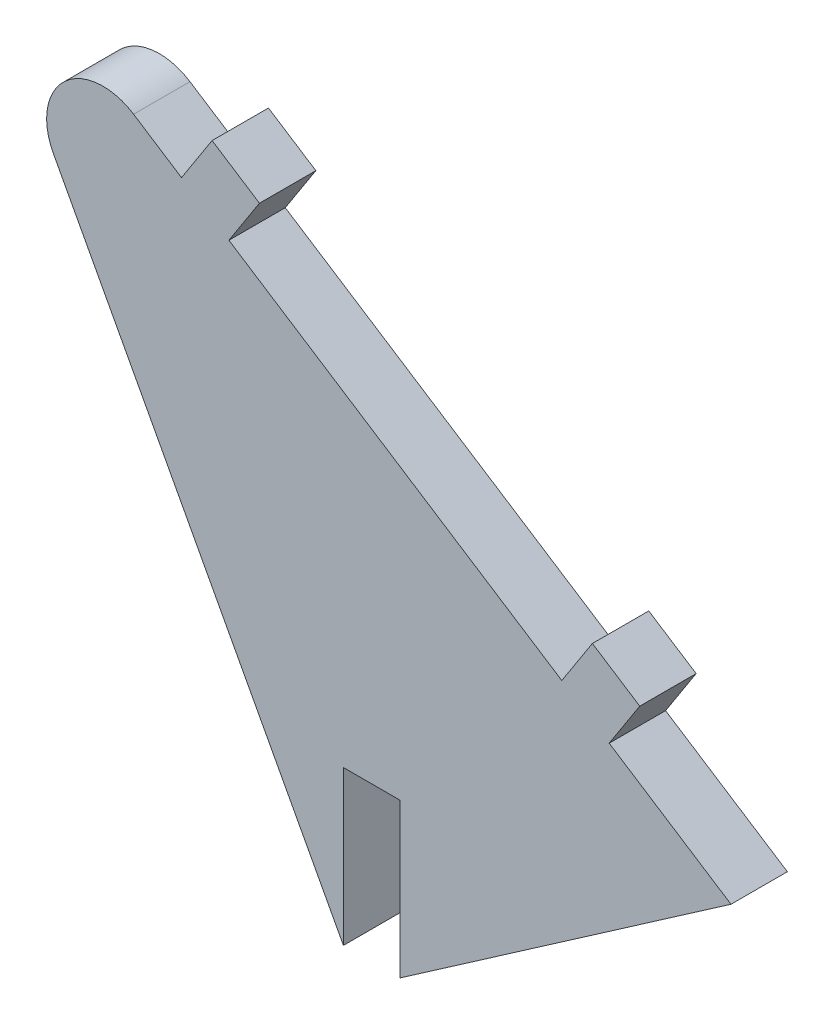
ISO-10303-21;
HEADER;
FILE_DESCRIPTION(('STEP AP214'),'2;1');
FILE_NAME('part.step','',(''),(''),'','','');
FILE_SCHEMA(('AUTOMOTIVE_DESIGN { 1 0 10303 214 1 1 1 1 }'));
ENDSEC;
DATA;
#1=APPLICATION_CONTEXT('core data for automotive mechanical design processes');
#2=APPLICATION_PROTOCOL_DEFINITION('international standard','automotive_design',2000,#1);
#3=PRODUCT_CONTEXT('',#1,'mechanical');
#4=PRODUCT('Part','Part','',(#3));
#5=PRODUCT_RELATED_PRODUCT_CATEGORY('part','',(#4));
#6=PRODUCT_DEFINITION_FORMATION('','',#4);
#7=PRODUCT_DEFINITION_CONTEXT('part definition',#1,'design');
#8=PRODUCT_DEFINITION('design','',#6,#7);
#9=PRODUCT_DEFINITION_SHAPE('','',#8);
#10=(LENGTH_UNIT() NAMED_UNIT(*) SI_UNIT(.MILLI.,.METRE.));
#11=(NAMED_UNIT(*) PLANE_ANGLE_UNIT() SI_UNIT($,.RADIAN.));
#12=(NAMED_UNIT(*) SI_UNIT($,.STERADIAN.) SOLID_ANGLE_UNIT());
#13=UNCERTAINTY_MEASURE_WITH_UNIT(LENGTH_MEASURE(1.E-05),#10,'distance_accuracy_value','');
#14=(GEOMETRIC_REPRESENTATION_CONTEXT(3) GLOBAL_UNCERTAINTY_ASSIGNED_CONTEXT((#13)) GLOBAL_UNIT_ASSIGNED_CONTEXT((#10,
#11,#12)) REPRESENTATION_CONTEXT('',''));
#15=CARTESIAN_POINT('',(0.,0.,0.));
#16=DIRECTION('',(0.,0.,1.));
#17=DIRECTION('',(1.,0.,0.));
#18=AXIS2_PLACEMENT_3D('',#15,#16,#17);
#19=CARTESIAN_POINT('',(-4.37541502486741,84.7624332406662,1.524));
#20=DIRECTION('',(0.840244242098891,-0.542208090699189,0.));
#21=DIRECTION('',(0.542208090699189,0.840244242098891,0.));
#22=AXIS2_PLACEMENT_3D('',#19,#20,#21);
#23=PLANE('',#22);
#24=DIRECTION('',(-0.542208090699189,-0.840244242098891,0.));
#25=VECTOR('',#24,1.);
#26=CARTESIAN_POINT('',(-4.37541502486741,84.7624332406662,0.));
#27=LINE('',#26,#25);
#28=CARTESIAN_POINT('',(-3.54908989464185,86.0429654656249,0.));
#29=VERTEX_POINT('',#28);
#30=CARTESIAN_POINT('',(-4.37541502486741,84.7624332406662,0.));
#31=VERTEX_POINT('',#30);
#32=EDGE_CURVE('E157',#29,#31,#27,.T.);
#33=ORIENTED_EDGE('',*,*,#32,.T.);
#34=DIRECTION('',(0.,0.,-1.));
#35=VECTOR('',#34,1.);
#36=CARTESIAN_POINT('',(-4.37541502486741,84.7624332406662,1.524));
#37=LINE('',#36,#35);
#38=CARTESIAN_POINT('',(-4.37541502486741,84.7624332406662,1.524));
#39=VERTEX_POINT('',#38);
#40=EDGE_CURVE('E140',#39,#31,#37,.T.);
#41=ORIENTED_EDGE('',*,*,#40,.F.);
#42=DIRECTION('',(-0.542208090699189,-0.840244242098891,0.));
#43=VECTOR('',#42,1.);
#44=CARTESIAN_POINT('',(-4.37541502486741,84.7624332406662,1.524));
#45=LINE('',#44,#43);
#46=CARTESIAN_POINT('',(-3.54908989464185,86.0429654656249,1.524));
#47=VERTEX_POINT('',#46);
#48=EDGE_CURVE('E145',#47,#39,#45,.T.);
#49=ORIENTED_EDGE('',*,*,#48,.F.);
#50=DIRECTION('',(0.,0.,-1.));
#51=VECTOR('',#50,1.);
#52=CARTESIAN_POINT('',(-3.54908989464185,86.0429654656249,1.524));
#53=LINE('',#52,#51);
#54=EDGE_CURVE('E197',#47,#29,#53,.T.);
#55=ORIENTED_EDGE('',*,*,#54,.T.);
#56=EDGE_LOOP('',(#33,#41,#49,#55));
#57=FACE_BOUND('',#56,.T.);
#58=ADVANCED_FACE('F33',(#57),#23,.F.);
#59=CARTESIAN_POINT('',(-10.628767587537,88.7977103465281,1.524));
#60=DIRECTION('',(-0.542208090699188,-0.840244242098892,0.));
#61=DIRECTION('',(0.840244242098892,-0.542208090699188,0.));
#62=AXIS2_PLACEMENT_3D('',#59,#60,#61);
#63=PLANE('',#62);
#64=DIRECTION('',(-0.840244242098892,0.542208090699188,0.));
#65=VECTOR('',#64,1.);
#66=CARTESIAN_POINT('',(-10.628767587537,88.7977103465281,0.));
#67=LINE('',#66,#65);
#68=CARTESIAN_POINT('',(-5.67048846499267,85.5981417907557,0.));
#69=VERTEX_POINT('',#68);
#70=EDGE_CURVE('E222',#31,#69,#67,.T.);
#71=ORIENTED_EDGE('',*,*,#70,.T.);
#72=DIRECTION('',(0.,0.,-1.));
#73=VECTOR('',#72,1.);
#74=CARTESIAN_POINT('',(-5.67048846499267,85.5981417907557,1.524));
#75=LINE('',#74,#73);
#76=CARTESIAN_POINT('',(-5.67048846499267,85.5981417907557,1.524));
#77=VERTEX_POINT('',#76);
#78=EDGE_CURVE('E41',#69,#77,#75,.F.);
#79=ORIENTED_EDGE('',*,*,#78,.T.);
#80=DIRECTION('',(-0.840244242098892,0.542208090699188,0.));
#81=VECTOR('',#80,1.);
#82=CARTESIAN_POINT('',(-10.628767587537,88.7977103465281,1.524));
#83=LINE('',#82,#81);
#84=EDGE_CURVE('E136',#39,#77,#83,.T.);
#85=ORIENTED_EDGE('',*,*,#84,.F.);
#86=ORIENTED_EDGE('',*,*,#40,.T.);
#87=EDGE_LOOP('',(#71,#79,#85,#86));
#88=FACE_BOUND('',#87,.T.);
#89=ADVANCED_FACE('F138',(#88),#63,.F.);
#90=CARTESIAN_POINT('',(0.,68.978612676176,1.524));
#91=DIRECTION('',(0.881268993731085,0.472615023764797,0.));
#92=DIRECTION('',(-0.472615023764797,0.881268993731085,0.));
#93=AXIS2_PLACEMENT_3D('',#90,#91,#92);
#94=PLANE('',#93);
#95=DIRECTION('',(0.472615023764797,-0.881268993731085,0.));
#96=VECTOR('',#95,1.);
#97=CARTESIAN_POINT('',(0.,68.978612676176,1.524));
#98=LINE('',#97,#96);
#99=CARTESIAN_POINT('',(-7.8398675416644,83.5973442695795,1.524));
#100=VERTEX_POINT('',#99);
#101=CARTESIAN_POINT('',(0.,68.978612676176,1.524));
#102=VERTEX_POINT('',#101);
#103=EDGE_CURVE('E144',#100,#102,#98,.T.);
#104=ORIENTED_EDGE('',*,*,#103,.F.);
#105=DIRECTION('',(0.,0.,-1.));
#106=VECTOR('',#105,1.);
#107=CARTESIAN_POINT('',(-7.8398675416644,83.5973442695795,1.524));
#108=LINE('',#107,#106);
#109=CARTESIAN_POINT('',(-7.8398675416644,83.5973442695795,0.));
#110=VERTEX_POINT('',#109);
#111=EDGE_CURVE('E158',#100,#110,#108,.T.);
#112=ORIENTED_EDGE('',*,*,#111,.T.);
#113=DIRECTION('',(0.472615023764797,-0.881268993731085,0.));
#114=VECTOR('',#113,1.);
#115=CARTESIAN_POINT('',(0.,68.978612676176,0.));
#116=LINE('',#115,#114);
#117=CARTESIAN_POINT('',(0.,68.978612676176,0.));
#118=VERTEX_POINT('',#117);
#119=EDGE_CURVE('E220',#110,#118,#116,.T.);
#120=ORIENTED_EDGE('',*,*,#119,.T.);
#121=DIRECTION('',(0.,0.,-1.));
#122=VECTOR('',#121,1.);
#123=CARTESIAN_POINT('',(0.,68.978612676176,1.524));
#124=LINE('',#123,#122);
#125=EDGE_CURVE('E159',#102,#118,#124,.T.);
#126=ORIENTED_EDGE('',*,*,#125,.F.);
#127=EDGE_LOOP('',(#104,#112,#120,#126));
#128=FACE_BOUND('',#127,.T.);
#129=ADVANCED_FACE('F252',(#128),#94,.F.);
#130=CARTESIAN_POINT('',(0.,73.1432627649411,1.524));
#131=DIRECTION('',(-1.,0.,0.));
#132=DIRECTION('',(0.,0.,1.));
#133=AXIS2_PLACEMENT_3D('',#130,#131,#132);
#134=PLANE('',#133);
#135=DIRECTION('',(0.,1.,0.));
#136=VECTOR('',#135,1.);
#137=CARTESIAN_POINT('',(0.,73.1432627649411,0.));
#138=LINE('',#137,#136);
#139=CARTESIAN_POINT('',(0.,73.1432627649411,0.));
#140=VERTEX_POINT('',#139);
#141=EDGE_CURVE('E218',#118,#140,#138,.T.);
#142=ORIENTED_EDGE('',*,*,#141,.T.);
#143=DIRECTION('',(0.,0.,-1.));
#144=VECTOR('',#143,1.);
#145=CARTESIAN_POINT('',(0.,73.1432627649411,1.524));
#146=LINE('',#145,#144);
#147=CARTESIAN_POINT('',(0.,73.1432627649411,1.524));
#148=VERTEX_POINT('',#147);
#149=EDGE_CURVE('E164',#148,#140,#146,.T.);
#150=ORIENTED_EDGE('',*,*,#149,.F.);
#151=DIRECTION('',(0.,1.,0.));
#152=VECTOR('',#151,1.);
#153=CARTESIAN_POINT('',(0.,73.1432627649411,1.524));
#154=LINE('',#153,#152);
#155=EDGE_CURVE('E244',#102,#148,#154,.T.);
#156=ORIENTED_EDGE('',*,*,#155,.F.);
#157=ORIENTED_EDGE('',*,*,#125,.T.);
#158=EDGE_LOOP('',(#142,#150,#156,#157));
#159=FACE_BOUND('',#158,.T.);
#160=ADVANCED_FACE('F255',(#159),#134,.F.);
#161=CARTESIAN_POINT('',(0.,73.1432627649411,1.524));
#162=DIRECTION('',(0.,1.,0.));
#163=DIRECTION('',(0.,0.,1.));
#164=AXIS2_PLACEMENT_3D('',#161,#162,#163);
#165=PLANE('',#164);
#166=DIRECTION('',(1.,0.,0.));
#167=VECTOR('',#166,1.);
#168=CARTESIAN_POINT('',(0.,73.1432627649411,0.));
#169=LINE('',#168,#167);
#170=CARTESIAN_POINT('',(1.524,73.1432627649411,0.));
#171=VERTEX_POINT('',#170);
#172=EDGE_CURVE('E216',#140,#171,#169,.T.);
#173=ORIENTED_EDGE('',*,*,#172,.T.);
#174=DIRECTION('',(0.,0.,-1.));
#175=VECTOR('',#174,1.);
#176=CARTESIAN_POINT('',(1.524,73.1432627649411,1.524));
#177=LINE('',#176,#175);
#178=CARTESIAN_POINT('',(1.524,73.1432627649411,1.524));
#179=VERTEX_POINT('',#178);
#180=EDGE_CURVE('E170',#179,#171,#177,.T.);
#181=ORIENTED_EDGE('',*,*,#180,.F.);
#182=DIRECTION('',(1.,0.,0.));
#183=VECTOR('',#182,1.);
#184=CARTESIAN_POINT('',(0.,73.1432627649411,1.524));
#185=LINE('',#184,#183);
#186=EDGE_CURVE('E242',#148,#179,#185,.T.);
#187=ORIENTED_EDGE('',*,*,#186,.F.);
#188=ORIENTED_EDGE('',*,*,#149,.T.);
#189=EDGE_LOOP('',(#173,#181,#187,#188));
#190=FACE_BOUND('',#189,.T.);
#191=ADVANCED_FACE('F260',(#190),#165,.F.);
#192=CARTESIAN_POINT('',(1.524,73.1432627649411,1.524));
#193=DIRECTION('',(1.,0.,0.));
#194=DIRECTION('',(0.,0.,-1.));
#195=AXIS2_PLACEMENT_3D('',#192,#193,#194);
#196=PLANE('',#195);
#197=DIRECTION('',(0.,-1.,0.));
#198=VECTOR('',#197,1.);
#199=CARTESIAN_POINT('',(1.524,73.1432627649411,0.));
#200=LINE('',#199,#198);
#201=CARTESIAN_POINT('',(1.524,68.978612676176,0.));
#202=VERTEX_POINT('',#201);
#203=EDGE_CURVE('E214',#171,#202,#200,.T.);
#204=ORIENTED_EDGE('',*,*,#203,.T.);
#205=DIRECTION('',(0.,0.,-1.));
#206=VECTOR('',#205,1.);
#207=CARTESIAN_POINT('',(1.524,68.978612676176,1.524));
#208=LINE('',#207,#206);
#209=CARTESIAN_POINT('',(1.524,68.978612676176,1.524));
#210=VERTEX_POINT('',#209);
#211=EDGE_CURVE('E173',#210,#202,#208,.T.);
#212=ORIENTED_EDGE('',*,*,#211,.F.);
#213=DIRECTION('',(0.,-1.,0.));
#214=VECTOR('',#213,1.);
#215=CARTESIAN_POINT('',(1.524,73.1432627649411,1.524));
#216=LINE('',#215,#214);
#217=EDGE_CURVE('E240',#179,#210,#216,.T.);
#218=ORIENTED_EDGE('',*,*,#217,.F.);
#219=ORIENTED_EDGE('',*,*,#180,.T.);
#220=EDGE_LOOP('',(#204,#212,#218,#219));
#221=FACE_BOUND('',#220,.T.);
#222=ADVANCED_FACE('F266',(#221),#196,.F.);
#223=CARTESIAN_POINT('',(1.524,68.978612676176,1.524));
#224=DIRECTION('',(-0.569475292041768,0.822008449928553,0.));
#225=DIRECTION('',(-0.822008449928553,-0.569475292041768,0.));
#226=AXIS2_PLACEMENT_3D('',#223,#224,#225);
#227=PLANE('',#226);
#228=DIRECTION('',(0.822008449928553,0.569475292041768,0.));
#229=VECTOR('',#228,1.);
#230=CARTESIAN_POINT('',(1.524,68.978612676176,0.));
#231=LINE('',#230,#229);
#232=CARTESIAN_POINT('',(10.4748163237073,75.1796057929724,0.));
#233=VERTEX_POINT('',#232);
#234=EDGE_CURVE('E212',#202,#233,#231,.T.);
#235=ORIENTED_EDGE('',*,*,#234,.T.);
#236=DIRECTION('',(0.,0.,-1.));
#237=VECTOR('',#236,1.);
#238=CARTESIAN_POINT('',(10.4748163237073,75.1796057929724,1.524));
#239=LINE('',#238,#237);
#240=CARTESIAN_POINT('',(10.4748163237073,75.1796057929724,1.524));
#241=VERTEX_POINT('',#240);
#242=EDGE_CURVE('E176',#241,#233,#239,.T.);
#243=ORIENTED_EDGE('',*,*,#242,.F.);
#244=DIRECTION('',(0.822008449928553,0.569475292041768,0.));
#245=VECTOR('',#244,1.);
#246=CARTESIAN_POINT('',(1.524,68.978612676176,1.524));
#247=LINE('',#246,#245);
#248=EDGE_CURVE('E238',#210,#241,#247,.T.);
#249=ORIENTED_EDGE('',*,*,#248,.F.);
#250=ORIENTED_EDGE('',*,*,#211,.T.);
#251=EDGE_LOOP('',(#235,#243,#249,#250));
#252=FACE_BOUND('',#251,.T.);
#253=ADVANCED_FACE('F270',(#252),#227,.F.);
#254=CARTESIAN_POINT('',(7.18302505408907,77.3037927494001,1.524));
#255=DIRECTION('',(-0.542208090699188,-0.840244242098892,0.));
#256=DIRECTION('',(0.840244242098892,-0.542208090699188,0.));
#257=AXIS2_PLACEMENT_3D('',#254,#255,#256);
#258=PLANE('',#257);
#259=DIRECTION('',(-0.840244242098892,0.542208090699188,0.));
#260=VECTOR('',#259,1.);
#261=CARTESIAN_POINT('',(7.18302505408907,77.3037927494001,0.));
#262=LINE('',#261,#260);
#263=CARTESIAN_POINT('',(7.18302505408907,77.3037927494001,0.));
#264=VERTEX_POINT('',#263);
#265=EDGE_CURVE('E210',#233,#264,#262,.T.);
#266=ORIENTED_EDGE('',*,*,#265,.T.);
#267=DIRECTION('',(0.,0.,-1.));
#268=VECTOR('',#267,1.);
#269=CARTESIAN_POINT('',(7.18302505408907,77.3037927494001,1.524));
#270=LINE('',#269,#268);
#271=CARTESIAN_POINT('',(7.18302505408907,77.3037927494001,1.524));
#272=VERTEX_POINT('',#271);
#273=EDGE_CURVE('E179',#272,#264,#270,.T.);
#274=ORIENTED_EDGE('',*,*,#273,.F.);
#275=DIRECTION('',(-0.840244242098892,0.542208090699188,0.));
#276=VECTOR('',#275,1.);
#277=CARTESIAN_POINT('',(7.18302505408907,77.3037927494001,1.524));
#278=LINE('',#277,#276);
#279=EDGE_CURVE('E236',#241,#272,#278,.T.);
#280=ORIENTED_EDGE('',*,*,#279,.F.);
#281=ORIENTED_EDGE('',*,*,#242,.T.);
#282=EDGE_LOOP('',(#266,#274,#280,#281));
#283=FACE_BOUND('',#282,.T.);
#284=ADVANCED_FACE('F275',(#283),#258,.F.);
#285=CARTESIAN_POINT('',(7.18302505408907,77.3037927494001,1.524));
#286=DIRECTION('',(-0.840244242098891,0.542208090699188,0.));
#287=DIRECTION('',(-0.542208090699189,-0.840244242098892,0.));
#288=AXIS2_PLACEMENT_3D('',#285,#286,#287);
#289=PLANE('',#288);
#290=DIRECTION('',(0.542208090699188,0.840244242098892,0.));
#291=VECTOR('',#290,1.);
#292=CARTESIAN_POINT('',(7.18302505408907,77.3037927494001,0.));
#293=LINE('',#292,#291);
#294=CARTESIAN_POINT('',(8.00935018431463,78.5843249743589,0.));
#295=VERTEX_POINT('',#294);
#296=EDGE_CURVE('E208',#264,#295,#293,.T.);
#297=ORIENTED_EDGE('',*,*,#296,.T.);
#298=DIRECTION('',(0.,0.,-1.));
#299=VECTOR('',#298,1.);
#300=CARTESIAN_POINT('',(8.00935018431463,78.5843249743589,1.524));
#301=LINE('',#300,#299);
#302=CARTESIAN_POINT('',(8.00935018431463,78.5843249743589,1.524));
#303=VERTEX_POINT('',#302);
#304=EDGE_CURVE('E182',#303,#295,#301,.T.);
#305=ORIENTED_EDGE('',*,*,#304,.F.);
#306=DIRECTION('',(0.542208090699188,0.840244242098892,0.));
#307=VECTOR('',#306,1.);
#308=CARTESIAN_POINT('',(7.18302505408907,77.3037927494001,1.524));
#309=LINE('',#308,#307);
#310=EDGE_CURVE('E234',#272,#303,#309,.T.);
#311=ORIENTED_EDGE('',*,*,#310,.F.);
#312=ORIENTED_EDGE('',*,*,#273,.T.);
#313=EDGE_LOOP('',(#297,#305,#311,#312));
#314=FACE_BOUND('',#313,.T.);
#315=ADVANCED_FACE('F281',(#314),#289,.F.);
#316=CARTESIAN_POINT('',(8.00935018431463,78.5843249743589,1.524));
#317=DIRECTION('',(-0.542208090699189,-0.840244242098891,0.));
#318=DIRECTION('',(0.840244242098891,-0.542208090699189,0.));
#319=AXIS2_PLACEMENT_3D('',#316,#317,#318);
#320=PLANE('',#319);
#321=DIRECTION('',(-0.840244242098891,0.542208090699189,0.));
#322=VECTOR('',#321,1.);
#323=CARTESIAN_POINT('',(8.00935018431463,78.5843249743589,0.));
#324=LINE('',#323,#322);
#325=CARTESIAN_POINT('',(6.72881795935591,79.4106501045844,0.));
#326=VERTEX_POINT('',#325);
#327=EDGE_CURVE('E206',#295,#326,#324,.T.);
#328=ORIENTED_EDGE('',*,*,#327,.T.);
#329=DIRECTION('',(0.,0.,-1.));
#330=VECTOR('',#329,1.);
#331=CARTESIAN_POINT('',(6.72881795935591,79.4106501045844,1.524));
#332=LINE('',#331,#330);
#333=CARTESIAN_POINT('',(6.72881795935591,79.4106501045844,1.524));
#334=VERTEX_POINT('',#333);
#335=EDGE_CURVE('E185',#334,#326,#332,.T.);
#336=ORIENTED_EDGE('',*,*,#335,.F.);
#337=DIRECTION('',(-0.840244242098891,0.542208090699189,0.));
#338=VECTOR('',#337,1.);
#339=CARTESIAN_POINT('',(8.00935018431463,78.5843249743589,1.524));
#340=LINE('',#339,#338);
#341=EDGE_CURVE('E232',#303,#334,#340,.T.);
#342=ORIENTED_EDGE('',*,*,#341,.F.);
#343=ORIENTED_EDGE('',*,*,#304,.T.);
#344=EDGE_LOOP('',(#328,#336,#342,#343));
#345=FACE_BOUND('',#344,.T.);
#346=ADVANCED_FACE('F285',(#345),#320,.F.);
#347=CARTESIAN_POINT('',(5.90249282913034,78.1301178796257,1.524));
#348=DIRECTION('',(0.840244242098893,-0.542208090699186,0.));
#349=DIRECTION('',(0.542208090699186,0.840244242098893,0.));
#350=AXIS2_PLACEMENT_3D('',#347,#348,#349);
#351=PLANE('',#350);
#352=DIRECTION('',(-0.542208090699186,-0.840244242098893,0.));
#353=VECTOR('',#352,1.);
#354=CARTESIAN_POINT('',(5.90249282913034,78.1301178796257,0.));
#355=LINE('',#354,#353);
#356=CARTESIAN_POINT('',(5.90249282913034,78.1301178796257,0.));
#357=VERTEX_POINT('',#356);
#358=EDGE_CURVE('E204',#326,#357,#355,.T.);
#359=ORIENTED_EDGE('',*,*,#358,.T.);
#360=DIRECTION('',(0.,0.,-1.));
#361=VECTOR('',#360,1.);
#362=CARTESIAN_POINT('',(5.90249282913034,78.1301178796257,1.524));
#363=LINE('',#362,#361);
#364=CARTESIAN_POINT('',(5.90249282913034,78.1301178796257,1.524));
#365=VERTEX_POINT('',#364);
#366=EDGE_CURVE('E188',#365,#357,#363,.T.);
#367=ORIENTED_EDGE('',*,*,#366,.F.);
#368=DIRECTION('',(-0.542208090699186,-0.840244242098893,0.));
#369=VECTOR('',#368,1.);
#370=CARTESIAN_POINT('',(5.90249282913034,78.1301178796257,1.524));
#371=LINE('',#370,#369);
#372=EDGE_CURVE('E230',#334,#365,#371,.T.);
#373=ORIENTED_EDGE('',*,*,#372,.F.);
#374=ORIENTED_EDGE('',*,*,#335,.T.);
#375=EDGE_LOOP('',(#359,#367,#373,#374));
#376=FACE_BOUND('',#375,.T.);
#377=ADVANCED_FACE('F290',(#376),#351,.F.);
#378=CARTESIAN_POINT('',(-3.09488279990869,83.9361081104406,1.524));
#379=DIRECTION('',(-0.542208090699189,-0.840244242098891,0.));
#380=DIRECTION('',(0.840244242098891,-0.542208090699189,0.));
#381=AXIS2_PLACEMENT_3D('',#378,#379,#380);
#382=PLANE('',#381);
#383=DIRECTION('',(-0.840244242098891,0.542208090699189,0.));
#384=VECTOR('',#383,1.);
#385=CARTESIAN_POINT('',(-3.09488279990869,83.9361081104406,0.));
#386=LINE('',#385,#384);
#387=CARTESIAN_POINT('',(-3.09488279990869,83.9361081104406,0.));
#388=VERTEX_POINT('',#387);
#389=EDGE_CURVE('E202',#357,#388,#386,.T.);
#390=ORIENTED_EDGE('',*,*,#389,.T.);
#391=DIRECTION('',(0.,0.,-1.));
#392=VECTOR('',#391,1.);
#393=CARTESIAN_POINT('',(-3.09488279990869,83.9361081104406,1.524));
#394=LINE('',#393,#392);
#395=CARTESIAN_POINT('',(-3.09488279990869,83.9361081104406,1.524));
#396=VERTEX_POINT('',#395);
#397=EDGE_CURVE('E191',#396,#388,#394,.T.);
#398=ORIENTED_EDGE('',*,*,#397,.F.);
#399=DIRECTION('',(-0.840244242098891,0.542208090699189,0.));
#400=VECTOR('',#399,1.);
#401=CARTESIAN_POINT('',(-3.09488279990869,83.9361081104406,1.524));
#402=LINE('',#401,#400);
#403=EDGE_CURVE('E228',#365,#396,#402,.T.);
#404=ORIENTED_EDGE('',*,*,#403,.F.);
#405=ORIENTED_EDGE('',*,*,#366,.T.);
#406=EDGE_LOOP('',(#390,#398,#404,#405));
#407=FACE_BOUND('',#406,.T.);
#408=ADVANCED_FACE('F296',(#407),#382,.F.);
#409=CARTESIAN_POINT('',(-3.09488279990869,83.9361081104406,1.524));
#410=DIRECTION('',(-0.84024424209889,0.54220809069919,0.));
#411=DIRECTION('',(-0.54220809069919,-0.84024424209889,0.));
#412=AXIS2_PLACEMENT_3D('',#409,#410,#411);
#413=PLANE('',#412);
#414=DIRECTION('',(0.54220809069919,0.84024424209889,0.));
#415=VECTOR('',#414,1.);
#416=CARTESIAN_POINT('',(-3.09488279990869,83.9361081104406,0.));
#417=LINE('',#416,#415);
#418=CARTESIAN_POINT('',(-2.26855766968313,85.2166403353993,0.));
#419=VERTEX_POINT('',#418);
#420=EDGE_CURVE('E200',#388,#419,#417,.T.);
#421=ORIENTED_EDGE('',*,*,#420,.T.);
#422=DIRECTION('',(0.,0.,-1.));
#423=VECTOR('',#422,1.);
#424=CARTESIAN_POINT('',(-2.26855766968313,85.2166403353993,1.524));
#425=LINE('',#424,#423);
#426=CARTESIAN_POINT('',(-2.26855766968313,85.2166403353993,1.524));
#427=VERTEX_POINT('',#426);
#428=EDGE_CURVE('E194',#427,#419,#425,.T.);
#429=ORIENTED_EDGE('',*,*,#428,.F.);
#430=DIRECTION('',(0.54220809069919,0.84024424209889,0.));
#431=VECTOR('',#430,1.);
#432=CARTESIAN_POINT('',(-3.09488279990869,83.9361081104406,1.524));
#433=LINE('',#432,#431);
#434=EDGE_CURVE('E226',#396,#427,#433,.T.);
#435=ORIENTED_EDGE('',*,*,#434,.F.);
#436=ORIENTED_EDGE('',*,*,#397,.T.);
#437=EDGE_LOOP('',(#421,#429,#435,#436));
#438=FACE_BOUND('',#437,.T.);
#439=ADVANCED_FACE('F300',(#438),#413,.F.);
#440=CARTESIAN_POINT('',(-3.54908989464185,86.0429654656249,1.524));
#441=DIRECTION('',(-0.542208090699189,-0.840244242098891,0.));
#442=DIRECTION('',(0.840244242098891,-0.542208090699189,0.));
#443=AXIS2_PLACEMENT_3D('',#440,#441,#442);
#444=PLANE('',#443);
#445=DIRECTION('',(-0.840244242098891,0.542208090699189,0.));
#446=VECTOR('',#445,1.);
#447=CARTESIAN_POINT('',(-3.54908989464185,86.0429654656249,0.));
#448=LINE('',#447,#446);
#449=EDGE_CURVE('E154',#419,#29,#448,.T.);
#450=ORIENTED_EDGE('',*,*,#449,.T.);
#451=ORIENTED_EDGE('',*,*,#54,.F.);
#452=DIRECTION('',(-0.840244242098891,0.542208090699189,0.));
#453=VECTOR('',#452,1.);
#454=CARTESIAN_POINT('',(-3.54908989464185,86.0429654656249,1.524));
#455=LINE('',#454,#453);
#456=EDGE_CURVE('E150',#427,#47,#455,.T.);
#457=ORIENTED_EDGE('',*,*,#456,.F.);
#458=ORIENTED_EDGE('',*,*,#428,.T.);
#459=EDGE_LOOP('',(#450,#451,#457,#458));
#460=FACE_BOUND('',#459,.T.);
#461=ADVANCED_FACE('F303',(#460),#444,.F.);
#462=CARTESIAN_POINT('',(0.,0.,1.524));
#463=DIRECTION('',(0.,0.,-1.));
#464=DIRECTION('',(-1.,0.,0.));
#465=AXIS2_PLACEMENT_3D('',#462,#463,#464);
#466=PLANE('',#465);
#467=ORIENTED_EDGE('',*,*,#84,.T.);
#468=CARTESIAN_POINT('',(-6.49681359521823,84.317609565797,1.524));
#469=DIRECTION('',(0.,0.,-1.));
#470=DIRECTION('',(-1.,0.,0.));
#471=AXIS2_PLACEMENT_3D('',#468,#469,#470);
#472=CIRCLE('',#471,1.524);
#473=EDGE_CURVE('E11',#77,#100,#472,.F.);
#474=ORIENTED_EDGE('',*,*,#473,.T.);
#475=ORIENTED_EDGE('',*,*,#103,.T.);
#476=ORIENTED_EDGE('',*,*,#155,.T.);
#477=ORIENTED_EDGE('',*,*,#186,.T.);
#478=ORIENTED_EDGE('',*,*,#217,.T.);
#479=ORIENTED_EDGE('',*,*,#248,.T.);
#480=ORIENTED_EDGE('',*,*,#279,.T.);
#481=ORIENTED_EDGE('',*,*,#310,.T.);
#482=ORIENTED_EDGE('',*,*,#341,.T.);
#483=ORIENTED_EDGE('',*,*,#372,.T.);
#484=ORIENTED_EDGE('',*,*,#403,.T.);
#485=ORIENTED_EDGE('',*,*,#434,.T.);
#486=ORIENTED_EDGE('',*,*,#456,.T.);
#487=ORIENTED_EDGE('',*,*,#48,.T.);
#488=EDGE_LOOP('',(#467,#474,#475,#476,#477,#478,#479,#480,#481,#482,#483,#484,#485,#486,#487));
#489=FACE_BOUND('',#488,.T.);
#490=ADVANCED_FACE('F148',(#489),#466,.F.);
#491=CARTESIAN_POINT('',(0.,0.,0.));
#492=DIRECTION('',(0.,0.,-1.));
#493=DIRECTION('',(-1.,0.,0.));
#494=AXIS2_PLACEMENT_3D('',#491,#492,#493);
#495=PLANE('',#494);
#496=ORIENTED_EDGE('',*,*,#119,.F.);
#497=CARTESIAN_POINT('',(-6.49681359521823,84.317609565797,0.));
#498=DIRECTION('',(0.,0.,-1.));
#499=DIRECTION('',(-1.,0.,0.));
#500=AXIS2_PLACEMENT_3D('',#497,#498,#499);
#501=CIRCLE('',#500,1.524);
#502=EDGE_CURVE('E55',#110,#69,#501,.T.);
#503=ORIENTED_EDGE('',*,*,#502,.T.);
#504=ORIENTED_EDGE('',*,*,#70,.F.);
#505=ORIENTED_EDGE('',*,*,#32,.F.);
#506=ORIENTED_EDGE('',*,*,#449,.F.);
#507=ORIENTED_EDGE('',*,*,#420,.F.);
#508=ORIENTED_EDGE('',*,*,#389,.F.);
#509=ORIENTED_EDGE('',*,*,#358,.F.);
#510=ORIENTED_EDGE('',*,*,#327,.F.);
#511=ORIENTED_EDGE('',*,*,#296,.F.);
#512=ORIENTED_EDGE('',*,*,#265,.F.);
#513=ORIENTED_EDGE('',*,*,#234,.F.);
#514=ORIENTED_EDGE('',*,*,#203,.F.);
#515=ORIENTED_EDGE('',*,*,#172,.F.);
#516=ORIENTED_EDGE('',*,*,#141,.F.);
#517=EDGE_LOOP('',(#496,#503,#504,#505,#506,#507,#508,#509,#510,#511,#512,#513,#514,#515,#516));
#518=FACE_BOUND('',#517,.T.);
#519=ADVANCED_FACE('F304',(#518),#495,.T.);
#520=CARTESIAN_POINT('',(-6.49681359521823,84.317609565797,1.524));
#521=DIRECTION('',(0.,0.,-1.));
#522=DIRECTION('',(-1.,0.,0.));
#523=AXIS2_PLACEMENT_3D('',#520,#521,#522);
#524=CYLINDRICAL_SURFACE('',#523,1.524);
#525=ORIENTED_EDGE('',*,*,#473,.F.);
#526=ORIENTED_EDGE('',*,*,#78,.F.);
#527=ORIENTED_EDGE('',*,*,#502,.F.);
#528=ORIENTED_EDGE('',*,*,#111,.F.);
#529=EDGE_LOOP('',(#525,#526,#527,#528));
#530=FACE_BOUND('',#529,.T.);
#531=ADVANCED_FACE('F35',(#530),#524,.T.);
#532=CLOSED_SHELL('',(#58,#89,#129,#160,#191,#222,#253,#284,#315,#346,#377,#408,#439,#461,#490,
#519,#531));
#533=MANIFOLD_SOLID_BREP('B2',#532);
#534=ADVANCED_BREP_SHAPE_REPRESENTATION('',(#18,#533),#14);
#535=SHAPE_DEFINITION_REPRESENTATION(#9,#534);
ENDSEC;
END-ISO-10303-21;
